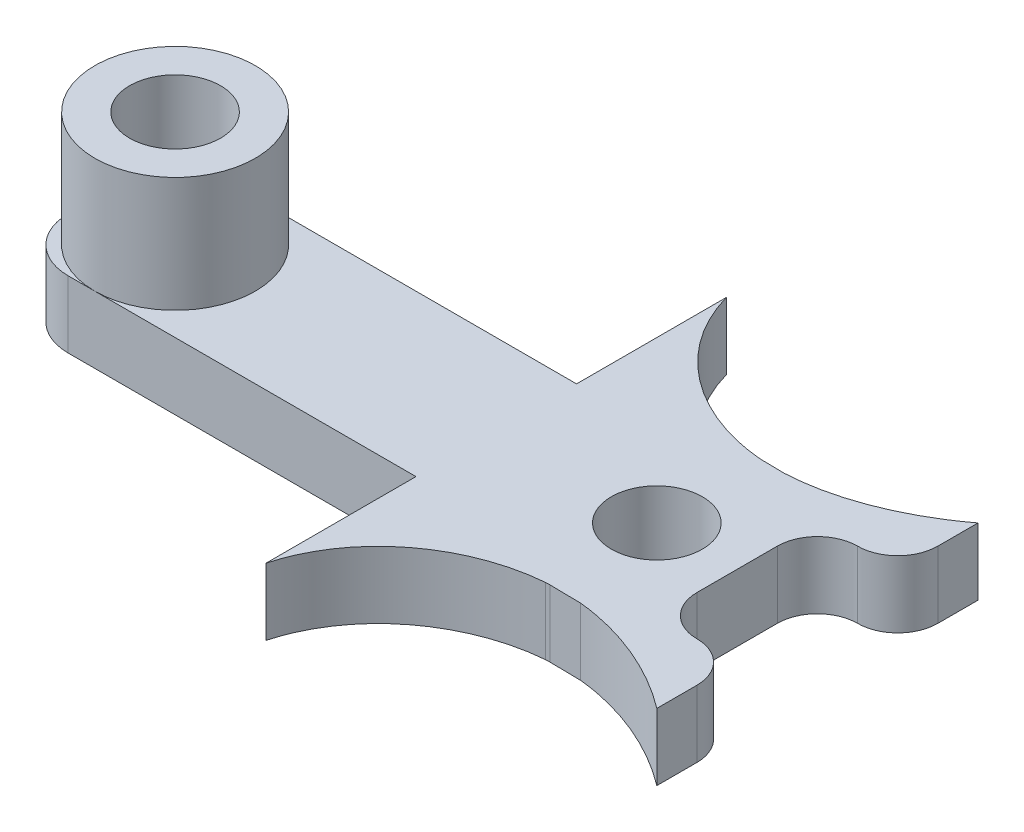
ISO-10303-21;
HEADER;
FILE_DESCRIPTION(('STEP AP214'),'2;1');
FILE_NAME('part.step','',(''),(''),'','','');
FILE_SCHEMA(('AUTOMOTIVE_DESIGN { 1 0 10303 214 1 1 1 1 }'));
ENDSEC;
DATA;
#1=APPLICATION_CONTEXT('core data for automotive mechanical design processes');
#2=APPLICATION_PROTOCOL_DEFINITION('international standard','automotive_design',2000,#1);
#3=PRODUCT_CONTEXT('',#1,'mechanical');
#4=PRODUCT('Part','Part','',(#3));
#5=PRODUCT_RELATED_PRODUCT_CATEGORY('part','',(#4));
#6=PRODUCT_DEFINITION_FORMATION('','',#4);
#7=PRODUCT_DEFINITION_CONTEXT('part definition',#1,'design');
#8=PRODUCT_DEFINITION('design','',#6,#7);
#9=PRODUCT_DEFINITION_SHAPE('','',#8);
#10=(LENGTH_UNIT() NAMED_UNIT(*) SI_UNIT(.MILLI.,.METRE.));
#11=(NAMED_UNIT(*) PLANE_ANGLE_UNIT() SI_UNIT($,.RADIAN.));
#12=(NAMED_UNIT(*) SI_UNIT($,.STERADIAN.) SOLID_ANGLE_UNIT());
#13=UNCERTAINTY_MEASURE_WITH_UNIT(LENGTH_MEASURE(1.E-05),#10,'distance_accuracy_value','');
#14=(GEOMETRIC_REPRESENTATION_CONTEXT(3) GLOBAL_UNCERTAINTY_ASSIGNED_CONTEXT((#13)) GLOBAL_UNIT_ASSIGNED_CONTEXT((#10,
#11,#12)) REPRESENTATION_CONTEXT('',''));
#15=CARTESIAN_POINT('',(0.,0.,0.));
#16=DIRECTION('',(0.,0.,1.));
#17=DIRECTION('',(1.,0.,0.));
#18=AXIS2_PLACEMENT_3D('',#15,#16,#17);
#19=CARTESIAN_POINT('',(10.,2.5,1.));
#20=DIRECTION('',(0.,1.,0.));
#21=DIRECTION('',(0.,0.,1.));
#22=AXIS2_PLACEMENT_3D('',#19,#20,#21);
#23=PLANE('',#22);
#24=DIRECTION('',(0.,0.,-1.));
#25=VECTOR('',#24,1.);
#26=CARTESIAN_POINT('',(12.,2.5,-0.999999999999984));
#27=LINE('',#26,#25);
#28=CARTESIAN_POINT('',(12.,2.5,1.5));
#29=VERTEX_POINT('',#28);
#30=CARTESIAN_POINT('',(12.,2.5,-1.5));
#31=VERTEX_POINT('',#30);
#32=EDGE_CURVE('E519',#29,#31,#27,.T.);
#33=ORIENTED_EDGE('',*,*,#32,.T.);
#34=CARTESIAN_POINT('',(13.5,2.5,-1.5));
#35=DIRECTION('',(0.,1.,0.));
#36=DIRECTION('',(0.,0.,1.));
#37=AXIS2_PLACEMENT_3D('',#34,#35,#36);
#38=CIRCLE('',#37,1.5);
#39=CARTESIAN_POINT('',(13.5,2.5,-3.));
#40=VERTEX_POINT('',#39);
#41=EDGE_CURVE('E60',#31,#40,#38,.F.);
#42=ORIENTED_EDGE('',*,*,#41,.T.);
#43=CARTESIAN_POINT('',(13.5,2.5,-4.5));
#44=DIRECTION('',(0.,1.,0.));
#45=DIRECTION('',(0.,0.,1.));
#46=AXIS2_PLACEMENT_3D('',#43,#44,#45);
#47=CIRCLE('',#46,1.5);
#48=CARTESIAN_POINT('',(15.,2.5,-4.5));
#49=VERTEX_POINT('',#48);
#50=EDGE_CURVE('E556',#40,#49,#47,.T.);
#51=ORIENTED_EDGE('',*,*,#50,.T.);
#52=DIRECTION('',(0.,0.,1.));
#53=VECTOR('',#52,1.);
#54=CARTESIAN_POINT('',(15.,2.5,-6.));
#55=LINE('',#54,#53);
#56=CARTESIAN_POINT('',(15.,2.5,-6.));
#57=VERTEX_POINT('',#56);
#58=EDGE_CURVE('E384',#57,#49,#55,.T.);
#59=ORIENTED_EDGE('',*,*,#58,.F.);
#60=CARTESIAN_POINT('',(3.,2.5,-8.6));
#61=CARTESIAN_POINT('',(3.75489441780132,2.5,-5.92427983008468));
#62=CARTESIAN_POINT('',(8.38153455470107,2.5,-2.77584994907777));
#63=CARTESIAN_POINT('',(13.2889752298641,2.5,-4.70512266492978));
#64=CARTESIAN_POINT('',(15.,2.5,-6.));
#65=B_SPLINE_CURVE_WITH_KNOTS('',3,(#60,#61,#62,#63,#64),.UNSPECIFIED.,.F.,.F.,(4,1,4),(0.,
0.541622599228357,1.),.UNSPECIFIED.);
#66=CARTESIAN_POINT('',(9.77847171737435,2.5,-3.98795360413678));
#67=VERTEX_POINT('',#66);
#68=EDGE_CURVE('E278',#67,#57,#65,.T.);
#69=ORIENTED_EDGE('',*,*,#68,.F.);
#70=DIRECTION('',(0.999880292709708,0.,0.0154725644528685));
#71=VECTOR('',#70,1.);
#72=CARTESIAN_POINT('',(10.0771141611198,2.5,-3.98333228647215));
#73=LINE('',#72,#71);
#74=CARTESIAN_POINT('',(9.,2.50000000000001,-4.));
#75=VERTEX_POINT('',#74);
#76=EDGE_CURVE('E327',#75,#67,#73,.T.);
#77=ORIENTED_EDGE('',*,*,#76,.F.);
#78=CARTESIAN_POINT('',(3.,2.5,-6.));
#79=CARTESIAN_POINT('',(5.68377223398316,2.5,-4.05131670194949));
#80=CARTESIAN_POINT('',(9.,2.5,-4.));
#81=B_SPLINE_CURVE_WITH_KNOTS('',2,(#78,#79,#80),.UNSPECIFIED.,.F.,.F.,(3,3),(0.,1.),.UNSPECIFIED.);
#82=CARTESIAN_POINT('',(8.84905438455814,2.5,-4.00332792716161));
#83=VERTEX_POINT('',#82);
#84=EDGE_CURVE('E383',#83,#75,#81,.T.);
#85=ORIENTED_EDGE('',*,*,#84,.F.);
#86=CARTESIAN_POINT('',(3.,2.5,-8.6));
#87=VERTEX_POINT('',#86);
#88=EDGE_CURVE('E268',#87,#83,#65,.T.);
#89=ORIENTED_EDGE('',*,*,#88,.F.);
#90=DIRECTION('',(0.,0.,-1.));
#91=VECTOR('',#90,1.);
#92=CARTESIAN_POINT('',(3.,2.5,-3.));
#93=LINE('',#92,#91);
#94=CARTESIAN_POINT('',(3.,2.5,-3.));
#95=VERTEX_POINT('',#94);
#96=EDGE_CURVE('E370',#95,#87,#93,.T.);
#97=ORIENTED_EDGE('',*,*,#96,.F.);
#98=DIRECTION('',(-1.,0.,0.));
#99=VECTOR('',#98,1.);
#100=CARTESIAN_POINT('',(-9.99999999999998,2.5,-3.));
#101=LINE('',#100,#99);
#102=CARTESIAN_POINT('',(-9.,2.5,-3.));
#103=VERTEX_POINT('',#102);
#104=EDGE_CURVE('E514',#95,#103,#101,.T.);
#105=ORIENTED_EDGE('',*,*,#104,.T.);
#106=CARTESIAN_POINT('',(-9.,2.5,0.));
#107=DIRECTION('',(0.,1.,0.));
#108=DIRECTION('',(0.,0.,1.));
#109=AXIS2_PLACEMENT_3D('',#106,#107,#108);
#110=CIRCLE('',#109,3.);
#111=CARTESIAN_POINT('',(-9.,2.5,3.));
#112=VERTEX_POINT('',#111);
#113=EDGE_CURVE('E512',#112,#103,#110,.T.);
#114=ORIENTED_EDGE('',*,*,#113,.F.);
#115=DIRECTION('',(1.,0.,0.));
#116=VECTOR('',#115,1.);
#117=CARTESIAN_POINT('',(-9.99999999999998,2.5,3.));
#118=LINE('',#117,#116);
#119=CARTESIAN_POINT('',(3.,2.5,3.));
#120=VERTEX_POINT('',#119);
#121=EDGE_CURVE('E210',#112,#120,#118,.T.);
#122=ORIENTED_EDGE('',*,*,#121,.T.);
#123=DIRECTION('',(0.,0.,-1.));
#124=VECTOR('',#123,1.);
#125=CARTESIAN_POINT('',(3.,2.5,6.));
#126=LINE('',#125,#124);
#127=CARTESIAN_POINT('',(3.,2.5,8.6));
#128=VERTEX_POINT('',#127);
#129=EDGE_CURVE('E203',#128,#120,#126,.T.);
#130=ORIENTED_EDGE('',*,*,#129,.F.);
#131=CARTESIAN_POINT('',(15.,2.5,6.));
#132=CARTESIAN_POINT('',(13.2877664091315,2.5,4.70152619520856));
#133=CARTESIAN_POINT('',(8.38380954941895,2.5,2.78716235232995));
#134=CARTESIAN_POINT('',(3.74372488756738,2.5,5.90317915996441));
#135=CARTESIAN_POINT('',(3.,2.5,8.6));
#136=B_SPLINE_CURVE_WITH_KNOTS('',3,(#131,#132,#133,#134,#135),.UNSPECIFIED.,.F.,.F.,(4,1,4),
(0.,0.458213087712618,1.),.UNSPECIFIED.);
#137=CARTESIAN_POINT('',(8.84905438406814,2.5,4.00332792717645));
#138=VERTEX_POINT('',#137);
#139=EDGE_CURVE('E207',#138,#128,#136,.T.);
#140=ORIENTED_EDGE('',*,*,#139,.F.);
#141=CARTESIAN_POINT('',(9.,2.5,4.));
#142=CARTESIAN_POINT('',(5.68377223398316,2.5,4.05131670194948));
#143=CARTESIAN_POINT('',(3.,2.5,6.));
#144=B_SPLINE_CURVE_WITH_KNOTS('',2,(#141,#142,#143),.UNSPECIFIED.,.F.,.F.,(3,3),(0.,1.),.UNSPECIFIED.);
#145=CARTESIAN_POINT('',(9.,2.5,4.));
#146=VERTEX_POINT('',#145);
#147=EDGE_CURVE('E342',#146,#138,#144,.T.);
#148=ORIENTED_EDGE('',*,*,#147,.F.);
#149=DIRECTION('',(-0.999880292709708,0.,-0.0154725644528686));
#150=VECTOR('',#149,1.);
#151=CARTESIAN_POINT('',(9.95334846292694,2.5,4.01475251152186));
#152=LINE('',#151,#150);
#153=CARTESIAN_POINT('',(10.1712546854507,2.5,4.01812448324414));
#154=VERTEX_POINT('',#153);
#155=EDGE_CURVE('E661',#154,#146,#152,.T.);
#156=ORIENTED_EDGE('',*,*,#155,.F.);
#157=CARTESIAN_POINT('',(15.,2.5,6.));
#158=VERTEX_POINT('',#157);
#159=EDGE_CURVE('E227',#158,#154,#136,.T.);
#160=ORIENTED_EDGE('',*,*,#159,.F.);
#161=DIRECTION('',(0.,0.,1.));
#162=VECTOR('',#161,1.);
#163=CARTESIAN_POINT('',(15.,2.5,3.));
#164=LINE('',#163,#162);
#165=CARTESIAN_POINT('',(15.,2.5,4.5));
#166=VERTEX_POINT('',#165);
#167=EDGE_CURVE('E334',#166,#158,#164,.T.);
#168=ORIENTED_EDGE('',*,*,#167,.F.);
#169=CARTESIAN_POINT('',(13.5,2.5,4.5));
#170=DIRECTION('',(0.,1.,0.));
#171=DIRECTION('',(0.,0.,1.));
#172=AXIS2_PLACEMENT_3D('',#169,#170,#171);
#173=CIRCLE('',#172,1.5);
#174=CARTESIAN_POINT('',(13.5,2.5,3.));
#175=VERTEX_POINT('',#174);
#176=EDGE_CURVE('E553',#166,#175,#173,.T.);
#177=ORIENTED_EDGE('',*,*,#176,.T.);
#178=CARTESIAN_POINT('',(13.5,2.5,1.5));
#179=DIRECTION('',(0.,1.,0.));
#180=DIRECTION('',(0.,0.,1.));
#181=AXIS2_PLACEMENT_3D('',#178,#179,#180);
#182=CIRCLE('',#181,1.5);
#183=EDGE_CURVE('E11',#175,#29,#182,.F.);
#184=ORIENTED_EDGE('',*,*,#183,.T.);
#185=EDGE_LOOP('',(#33,#42,#51,#59,#69,#77,#85,#89,#97,#105,#114,#122,#130,#140,#148,#156,#160,
#168,#177,#184));
#186=FACE_BOUND('',#185,.T.);
#187=CARTESIAN_POINT('',(9.,2.5,0.));
#188=DIRECTION('',(0.,1.,0.));
#189=DIRECTION('',(0.,0.,1.));
#190=AXIS2_PLACEMENT_3D('',#187,#188,#189);
#191=CIRCLE('',#190,1.7);
#192=CARTESIAN_POINT('',(9.,2.5,1.7));
#193=VERTEX_POINT('',#192);
#194=EDGE_CURVE('E966',#193,#193,#191,.T.);
#195=ORIENTED_EDGE('',*,*,#194,.F.);
#196=EDGE_LOOP('',(#195));
#197=FACE_BOUND('',#196,.T.);
#198=ADVANCED_FACE('F42',(#186,#197),#23,.T.);
#199=CARTESIAN_POINT('',(-12.,2.5,0.));
#200=VERTEX_POINT('',#199);
#201=EDGE_CURVE('E499',#103,#200,#110,.T.);
#202=ORIENTED_EDGE('',*,*,#201,.F.);
#203=CARTESIAN_POINT('',(-9.99999999999998,2.5,-3.));
#204=VERTEX_POINT('',#203);
#205=EDGE_CURVE('E501',#103,#204,#101,.T.);
#206=ORIENTED_EDGE('',*,*,#205,.T.);
#207=CARTESIAN_POINT('',(-10.,2.5,-1.));
#208=DIRECTION('',(0.,1.,0.));
#209=DIRECTION('',(0.,0.,1.));
#210=AXIS2_PLACEMENT_3D('',#207,#208,#209);
#211=CIRCLE('',#210,2.);
#212=CARTESIAN_POINT('',(-12.,2.5,-0.999999999999987));
#213=VERTEX_POINT('',#212);
#214=EDGE_CURVE('E598',#204,#213,#211,.T.);
#215=ORIENTED_EDGE('',*,*,#214,.T.);
#216=DIRECTION('',(0.,0.,1.));
#217=VECTOR('',#216,1.);
#218=CARTESIAN_POINT('',(-12.,2.5,-0.999999999999987));
#219=LINE('',#218,#217);
#220=EDGE_CURVE('E504',#213,#200,#219,.T.);
#221=ORIENTED_EDGE('',*,*,#220,.T.);
#222=EDGE_LOOP('',(#202,#206,#215,#221));
#223=FACE_BOUND('',#222,.T.);
#224=ADVANCED_FACE('F445',(#223),#23,.T.);
#225=EDGE_CURVE('E510',#200,#112,#110,.T.);
#226=ORIENTED_EDGE('',*,*,#225,.F.);
#227=CARTESIAN_POINT('',(-12.,2.5,0.999999999999985));
#228=VERTEX_POINT('',#227);
#229=EDGE_CURVE('E601',#200,#228,#219,.T.);
#230=ORIENTED_EDGE('',*,*,#229,.T.);
#231=CARTESIAN_POINT('',(-10.,2.5,0.999999999999999));
#232=DIRECTION('',(0.,1.,0.));
#233=DIRECTION('',(0.,0.,1.));
#234=AXIS2_PLACEMENT_3D('',#231,#232,#233);
#235=CIRCLE('',#234,2.);
#236=CARTESIAN_POINT('',(-9.99999999999998,2.5,3.));
#237=VERTEX_POINT('',#236);
#238=EDGE_CURVE('E604',#228,#237,#235,.T.);
#239=ORIENTED_EDGE('',*,*,#238,.T.);
#240=EDGE_CURVE('E607',#237,#112,#118,.T.);
#241=ORIENTED_EDGE('',*,*,#240,.T.);
#242=EDGE_LOOP('',(#226,#230,#239,#241));
#243=FACE_BOUND('',#242,.T.);
#244=ADVANCED_FACE('F441',(#243),#23,.T.);
#245=CARTESIAN_POINT('',(10.,0.,1.));
#246=DIRECTION('',(0.,1.,0.));
#247=DIRECTION('',(0.,0.,1.));
#248=AXIS2_PLACEMENT_3D('',#245,#246,#247);
#249=PLANE('',#248);
#250=DIRECTION('',(0.,0.,1.));
#251=VECTOR('',#250,1.);
#252=CARTESIAN_POINT('',(15.,0.,-6.));
#253=LINE('',#252,#251);
#254=CARTESIAN_POINT('',(15.,0.,-6.));
#255=VERTEX_POINT('',#254);
#256=CARTESIAN_POINT('',(15.,0.,-4.5));
#257=VERTEX_POINT('',#256);
#258=EDGE_CURVE('E366',#255,#257,#253,.T.);
#259=ORIENTED_EDGE('',*,*,#258,.T.);
#260=CARTESIAN_POINT('',(13.5,0.,-4.5));
#261=DIRECTION('',(0.,1.,0.));
#262=DIRECTION('',(0.,0.,1.));
#263=AXIS2_PLACEMENT_3D('',#260,#261,#262);
#264=CIRCLE('',#263,1.5);
#265=CARTESIAN_POINT('',(13.5,0.,-3.));
#266=VERTEX_POINT('',#265);
#267=EDGE_CURVE('E550',#257,#266,#264,.F.);
#268=ORIENTED_EDGE('',*,*,#267,.T.);
#269=CARTESIAN_POINT('',(13.5,0.,-1.5));
#270=DIRECTION('',(0.,1.,0.));
#271=DIRECTION('',(0.,0.,1.));
#272=AXIS2_PLACEMENT_3D('',#269,#270,#271);
#273=CIRCLE('',#272,1.5);
#274=CARTESIAN_POINT('',(12.,0.,-1.5));
#275=VERTEX_POINT('',#274);
#276=EDGE_CURVE('E570',#266,#275,#273,.T.);
#277=ORIENTED_EDGE('',*,*,#276,.T.);
#278=DIRECTION('',(0.,0.,-1.));
#279=VECTOR('',#278,1.);
#280=CARTESIAN_POINT('',(12.,0.,-0.999999999999984));
#281=LINE('',#280,#279);
#282=CARTESIAN_POINT('',(12.,0.,1.5));
#283=VERTEX_POINT('',#282);
#284=EDGE_CURVE('E578',#283,#275,#281,.T.);
#285=ORIENTED_EDGE('',*,*,#284,.F.);
#286=CARTESIAN_POINT('',(13.5,0.,1.5));
#287=DIRECTION('',(0.,1.,0.));
#288=DIRECTION('',(0.,0.,1.));
#289=AXIS2_PLACEMENT_3D('',#286,#287,#288);
#290=CIRCLE('',#289,1.5);
#291=CARTESIAN_POINT('',(13.5,0.,3.));
#292=VERTEX_POINT('',#291);
#293=EDGE_CURVE('E52',#283,#292,#290,.T.);
#294=ORIENTED_EDGE('',*,*,#293,.T.);
#295=CARTESIAN_POINT('',(13.5,0.,4.5));
#296=DIRECTION('',(0.,1.,0.));
#297=DIRECTION('',(0.,0.,1.));
#298=AXIS2_PLACEMENT_3D('',#295,#296,#297);
#299=CIRCLE('',#298,1.5);
#300=CARTESIAN_POINT('',(15.,0.,4.5));
#301=VERTEX_POINT('',#300);
#302=EDGE_CURVE('E547',#292,#301,#299,.F.);
#303=ORIENTED_EDGE('',*,*,#302,.T.);
#304=DIRECTION('',(0.,0.,1.));
#305=VECTOR('',#304,1.);
#306=CARTESIAN_POINT('',(15.,0.,3.));
#307=LINE('',#306,#305);
#308=CARTESIAN_POINT('',(15.,0.,6.));
#309=VERTEX_POINT('',#308);
#310=EDGE_CURVE('E216',#301,#309,#307,.T.);
#311=ORIENTED_EDGE('',*,*,#310,.T.);
#312=CARTESIAN_POINT('',(15.,0.,6.));
#313=CARTESIAN_POINT('',(13.2877664091315,0.,4.70152619520856));
#314=CARTESIAN_POINT('',(8.38380954941895,0.,2.78716235232995));
#315=CARTESIAN_POINT('',(3.74372488756738,0.,5.90317915996441));
#316=CARTESIAN_POINT('',(3.,0.,8.6));
#317=B_SPLINE_CURVE_WITH_KNOTS('',3,(#312,#313,#314,#315,#316),.UNSPECIFIED.,.F.,.F.,(4,1,4),
(0.,0.458213087712618,1.),.UNSPECIFIED.);
#318=CARTESIAN_POINT('',(10.1712546854507,0.,4.01812448324414));
#319=VERTEX_POINT('',#318);
#320=EDGE_CURVE('E246',#309,#319,#317,.T.);
#321=ORIENTED_EDGE('',*,*,#320,.T.);
#322=DIRECTION('',(0.999880292709708,0.,0.0154725644528686));
#323=VECTOR('',#322,1.);
#324=CARTESIAN_POINT('',(9.,0.,4.));
#325=LINE('',#324,#323);
#326=CARTESIAN_POINT('',(9.,0.,4.));
#327=VERTEX_POINT('',#326);
#328=EDGE_CURVE('E655',#327,#319,#325,.T.);
#329=ORIENTED_EDGE('',*,*,#328,.F.);
#330=CARTESIAN_POINT('',(9.,0.,4.));
#331=CARTESIAN_POINT('',(5.68377223398316,0.,4.05131670194948));
#332=CARTESIAN_POINT('',(3.,0.,6.));
#333=B_SPLINE_CURVE_WITH_KNOTS('',2,(#330,#331,#332),.UNSPECIFIED.,.F.,.F.,(3,3),(0.,1.),.UNSPECIFIED.);
#334=CARTESIAN_POINT('',(8.8490543840833,0.,4.00332792717521));
#335=VERTEX_POINT('',#334);
#336=EDGE_CURVE('E352',#327,#335,#333,.T.);
#337=ORIENTED_EDGE('',*,*,#336,.T.);
#338=CARTESIAN_POINT('',(3.,0.,8.6));
#339=VERTEX_POINT('',#338);
#340=EDGE_CURVE('E245',#335,#339,#317,.T.);
#341=ORIENTED_EDGE('',*,*,#340,.T.);
#342=DIRECTION('',(0.,0.,-1.));
#343=VECTOR('',#342,1.);
#344=CARTESIAN_POINT('',(3.,0.,6.));
#345=LINE('',#344,#343);
#346=CARTESIAN_POINT('',(3.,0.,3.));
#347=VERTEX_POINT('',#346);
#348=EDGE_CURVE('E230',#339,#347,#345,.T.);
#349=ORIENTED_EDGE('',*,*,#348,.T.);
#350=DIRECTION('',(1.,0.,0.));
#351=VECTOR('',#350,1.);
#352=CARTESIAN_POINT('',(-9.99999999999998,0.,3.));
#353=LINE('',#352,#351);
#354=CARTESIAN_POINT('',(-9.99999999999998,0.,3.));
#355=VERTEX_POINT('',#354);
#356=EDGE_CURVE('E587',#355,#347,#353,.T.);
#357=ORIENTED_EDGE('',*,*,#356,.F.);
#358=CARTESIAN_POINT('',(-10.,0.,0.999999999999999));
#359=DIRECTION('',(0.,1.,0.));
#360=DIRECTION('',(0.,0.,1.));
#361=AXIS2_PLACEMENT_3D('',#358,#359,#360);
#362=CIRCLE('',#361,2.);
#363=CARTESIAN_POINT('',(-12.,0.,0.999999999999985));
#364=VERTEX_POINT('',#363);
#365=EDGE_CURVE('E591',#364,#355,#362,.T.);
#366=ORIENTED_EDGE('',*,*,#365,.F.);
#367=DIRECTION('',(0.,0.,1.));
#368=VECTOR('',#367,1.);
#369=CARTESIAN_POINT('',(-12.,0.,-0.999999999999987));
#370=LINE('',#369,#368);
#371=CARTESIAN_POINT('',(-12.,0.,-0.999999999999987));
#372=VERTEX_POINT('',#371);
#373=EDGE_CURVE('E619',#372,#364,#370,.T.);
#374=ORIENTED_EDGE('',*,*,#373,.F.);
#375=CARTESIAN_POINT('',(-10.,0.,-1.));
#376=DIRECTION('',(0.,1.,0.));
#377=DIRECTION('',(0.,0.,1.));
#378=AXIS2_PLACEMENT_3D('',#375,#376,#377);
#379=CIRCLE('',#378,2.);
#380=CARTESIAN_POINT('',(-9.99999999999998,0.,-3.));
#381=VERTEX_POINT('',#380);
#382=EDGE_CURVE('E616',#381,#372,#379,.T.);
#383=ORIENTED_EDGE('',*,*,#382,.F.);
#384=DIRECTION('',(-1.,0.,0.));
#385=VECTOR('',#384,1.);
#386=CARTESIAN_POINT('',(-9.99999999999998,0.,-3.));
#387=LINE('',#386,#385);
#388=CARTESIAN_POINT('',(3.,0.,-3.));
#389=VERTEX_POINT('',#388);
#390=EDGE_CURVE('E613',#389,#381,#387,.T.);
#391=ORIENTED_EDGE('',*,*,#390,.F.);
#392=DIRECTION('',(0.,0.,-1.));
#393=VECTOR('',#392,1.);
#394=CARTESIAN_POINT('',(3.,0.,-3.));
#395=LINE('',#394,#393);
#396=CARTESIAN_POINT('',(3.,0.,-8.6));
#397=VERTEX_POINT('',#396);
#398=EDGE_CURVE('E358',#389,#397,#395,.T.);
#399=ORIENTED_EDGE('',*,*,#398,.T.);
#400=CARTESIAN_POINT('',(3.,0.,-8.6));
#401=CARTESIAN_POINT('',(3.75489441780132,0.,-5.92427983008468));
#402=CARTESIAN_POINT('',(8.38153455470107,0.,-2.77584994907777));
#403=CARTESIAN_POINT('',(13.2889752298641,0.,-4.70512266492978));
#404=CARTESIAN_POINT('',(15.,0.,-6.));
#405=B_SPLINE_CURVE_WITH_KNOTS('',3,(#400,#401,#402,#403,#404),.UNSPECIFIED.,.F.,.F.,(4,1,4),
(0.,0.541622599228357,1.),.UNSPECIFIED.);
#406=CARTESIAN_POINT('',(8.84905438454743,0.,-4.0033279271625));
#407=VERTEX_POINT('',#406);
#408=EDGE_CURVE('E261',#397,#407,#405,.T.);
#409=ORIENTED_EDGE('',*,*,#408,.T.);
#410=CARTESIAN_POINT('',(3.,0.,-6.));
#411=CARTESIAN_POINT('',(5.68377223398316,0.,-4.05131670194949));
#412=CARTESIAN_POINT('',(9.,0.,-4.));
#413=B_SPLINE_CURVE_WITH_KNOTS('',2,(#410,#411,#412),.UNSPECIFIED.,.F.,.F.,(3,3),(0.,1.),.UNSPECIFIED.);
#414=CARTESIAN_POINT('',(9.,0.,-4.));
#415=VERTEX_POINT('',#414);
#416=EDGE_CURVE('E371',#407,#415,#413,.T.);
#417=ORIENTED_EDGE('',*,*,#416,.T.);
#418=DIRECTION('',(-0.999880292709708,0.,-0.0154725644528685));
#419=VECTOR('',#418,1.);
#420=CARTESIAN_POINT('',(9.,0.,-4.));
#421=LINE('',#420,#419);
#422=CARTESIAN_POINT('',(9.77847171737436,0.,-3.98795360413678));
#423=VERTEX_POINT('',#422);
#424=EDGE_CURVE('E649',#423,#415,#421,.T.);
#425=ORIENTED_EDGE('',*,*,#424,.F.);
#426=EDGE_CURVE('E260',#423,#255,#405,.T.);
#427=ORIENTED_EDGE('',*,*,#426,.T.);
#428=EDGE_LOOP('',(#259,#268,#277,#285,#294,#303,#311,#321,#329,#337,#341,#349,#357,#366,#374,
#383,#391,#399,#409,#417,#425,#427));
#429=FACE_BOUND('',#428,.T.);
#430=CARTESIAN_POINT('',(-9.,0.,0.));
#431=DIRECTION('',(0.,1.,0.));
#432=DIRECTION('',(0.,0.,1.));
#433=AXIS2_PLACEMENT_3D('',#430,#431,#432);
#434=CIRCLE('',#433,1.7);
#435=CARTESIAN_POINT('',(-9.,0.,1.7));
#436=VERTEX_POINT('',#435);
#437=EDGE_CURVE('E594',#436,#436,#434,.T.);
#438=ORIENTED_EDGE('',*,*,#437,.T.);
#439=EDGE_LOOP('',(#438));
#440=FACE_BOUND('',#439,.T.);
#441=CARTESIAN_POINT('',(9.,0.,0.));
#442=DIRECTION('',(0.,1.,0.));
#443=DIRECTION('',(0.,0.,1.));
#444=AXIS2_PLACEMENT_3D('',#441,#442,#443);
#445=CIRCLE('',#444,1.7);
#446=CARTESIAN_POINT('',(9.,0.,1.7));
#447=VERTEX_POINT('',#446);
#448=EDGE_CURVE('E526',#447,#447,#445,.T.);
#449=ORIENTED_EDGE('',*,*,#448,.T.);
#450=EDGE_LOOP('',(#449));
#451=FACE_BOUND('',#450,.T.);
#452=ADVANCED_FACE('F444',(#429,#440,#451),#249,.F.);
#453=CARTESIAN_POINT('',(12.,2.5,-0.999999999999984));
#454=DIRECTION('',(-1.,0.,0.));
#455=DIRECTION('',(0.,0.,1.));
#456=AXIS2_PLACEMENT_3D('',#453,#454,#455);
#457=PLANE('',#456);
#458=ORIENTED_EDGE('',*,*,#284,.T.);
#459=DIRECTION('',(0.,1.,0.));
#460=VECTOR('',#459,1.);
#461=CARTESIAN_POINT('',(12.,2.5,-1.5));
#462=LINE('',#461,#460);
#463=EDGE_CURVE('E68',#275,#31,#462,.T.);
#464=ORIENTED_EDGE('',*,*,#463,.T.);
#465=ORIENTED_EDGE('',*,*,#32,.F.);
#466=DIRECTION('',(0.,-1.,0.));
#467=VECTOR('',#466,1.);
#468=CARTESIAN_POINT('',(12.,2.5,1.5));
#469=LINE('',#468,#467);
#470=EDGE_CURVE('E559',#29,#283,#469,.T.);
#471=ORIENTED_EDGE('',*,*,#470,.T.);
#472=EDGE_LOOP('',(#458,#464,#465,#471));
#473=FACE_BOUND('',#472,.T.);
#474=ADVANCED_FACE('F449',(#473),#457,.F.);
#475=CARTESIAN_POINT('',(-9.99999999999998,2.5,-3.));
#476=DIRECTION('',(0.,0.,1.));
#477=DIRECTION('',(1.,0.,0.));
#478=AXIS2_PLACEMENT_3D('',#475,#476,#477);
#479=PLANE('',#478);
#480=ORIENTED_EDGE('',*,*,#104,.F.);
#481=DIRECTION('',(0.,-1.,0.));
#482=VECTOR('',#481,1.);
#483=CARTESIAN_POINT('',(3.,14.869316876853,-3.));
#484=LINE('',#483,#482);
#485=EDGE_CURVE('E388',#95,#389,#484,.T.);
#486=ORIENTED_EDGE('',*,*,#485,.T.);
#487=ORIENTED_EDGE('',*,*,#390,.T.);
#488=DIRECTION('',(0.,-1.,0.));
#489=VECTOR('',#488,1.);
#490=CARTESIAN_POINT('',(-9.99999999999998,2.5,-3.));
#491=LINE('',#490,#489);
#492=EDGE_CURVE('E516',#204,#381,#491,.T.);
#493=ORIENTED_EDGE('',*,*,#492,.F.);
#494=ORIENTED_EDGE('',*,*,#205,.F.);
#495=EDGE_LOOP('',(#480,#486,#487,#493,#494));
#496=FACE_BOUND('',#495,.T.);
#497=ADVANCED_FACE('F465',(#496),#479,.F.);
#498=CARTESIAN_POINT('',(-10.,2.5,-1.));
#499=DIRECTION('',(0.,-1.,0.));
#500=DIRECTION('',(0.,0.,-1.));
#501=AXIS2_PLACEMENT_3D('',#498,#499,#500);
#502=CYLINDRICAL_SURFACE('',#501,2.);
#503=ORIENTED_EDGE('',*,*,#382,.T.);
#504=DIRECTION('',(0.,-1.,0.));
#505=VECTOR('',#504,1.);
#506=CARTESIAN_POINT('',(-12.,2.5,-0.999999999999987));
#507=LINE('',#506,#505);
#508=EDGE_CURVE('E531',#213,#372,#507,.T.);
#509=ORIENTED_EDGE('',*,*,#508,.F.);
#510=ORIENTED_EDGE('',*,*,#214,.F.);
#511=ORIENTED_EDGE('',*,*,#492,.T.);
#512=EDGE_LOOP('',(#503,#509,#510,#511));
#513=FACE_BOUND('',#512,.T.);
#514=ADVANCED_FACE('F461',(#513),#502,.T.);
#515=CARTESIAN_POINT('',(-12.,2.5,-0.999999999999987));
#516=DIRECTION('',(1.,0.,0.));
#517=DIRECTION('',(0.,0.,-1.));
#518=AXIS2_PLACEMENT_3D('',#515,#516,#517);
#519=PLANE('',#518);
#520=ORIENTED_EDGE('',*,*,#373,.T.);
#521=DIRECTION('',(0.,-1.,0.));
#522=VECTOR('',#521,1.);
#523=CARTESIAN_POINT('',(-12.,2.5,0.999999999999985));
#524=LINE('',#523,#522);
#525=EDGE_CURVE('E536',#228,#364,#524,.T.);
#526=ORIENTED_EDGE('',*,*,#525,.F.);
#527=ORIENTED_EDGE('',*,*,#229,.F.);
#528=ORIENTED_EDGE('',*,*,#220,.F.);
#529=ORIENTED_EDGE('',*,*,#508,.T.);
#530=EDGE_LOOP('',(#520,#526,#527,#528,#529));
#531=FACE_BOUND('',#530,.T.);
#532=ADVANCED_FACE('F457',(#531),#519,.F.);
#533=CARTESIAN_POINT('',(-10.,2.5,0.999999999999999));
#534=DIRECTION('',(0.,-1.,0.));
#535=DIRECTION('',(0.,0.,-1.));
#536=AXIS2_PLACEMENT_3D('',#533,#534,#535);
#537=CYLINDRICAL_SURFACE('',#536,2.);
#538=ORIENTED_EDGE('',*,*,#365,.T.);
#539=DIRECTION('',(0.,-1.,0.));
#540=VECTOR('',#539,1.);
#541=CARTESIAN_POINT('',(-9.99999999999998,2.5,3.));
#542=LINE('',#541,#540);
#543=EDGE_CURVE('E610',#237,#355,#542,.T.);
#544=ORIENTED_EDGE('',*,*,#543,.F.);
#545=ORIENTED_EDGE('',*,*,#238,.F.);
#546=ORIENTED_EDGE('',*,*,#525,.T.);
#547=EDGE_LOOP('',(#538,#544,#545,#546));
#548=FACE_BOUND('',#547,.T.);
#549=ADVANCED_FACE('F453',(#548),#537,.T.);
#550=CARTESIAN_POINT('',(-9.99999999999998,2.5,3.));
#551=DIRECTION('',(0.,0.,-1.));
#552=DIRECTION('',(-1.,0.,0.));
#553=AXIS2_PLACEMENT_3D('',#550,#551,#552);
#554=PLANE('',#553);
#555=ORIENTED_EDGE('',*,*,#356,.T.);
#556=DIRECTION('',(0.,-1.,0.));
#557=VECTOR('',#556,1.);
#558=CARTESIAN_POINT('',(3.,14.869316876853,3.));
#559=LINE('',#558,#557);
#560=EDGE_CURVE('E217',#120,#347,#559,.T.);
#561=ORIENTED_EDGE('',*,*,#560,.F.);
#562=ORIENTED_EDGE('',*,*,#121,.F.);
#563=ORIENTED_EDGE('',*,*,#240,.F.);
#564=ORIENTED_EDGE('',*,*,#543,.T.);
#565=EDGE_LOOP('',(#555,#561,#562,#563,#564));
#566=FACE_BOUND('',#565,.T.);
#567=ADVANCED_FACE('F439',(#566),#554,.F.);
#568=CARTESIAN_POINT('',(-9.,2.5,0.));
#569=DIRECTION('',(0.,-1.,0.));
#570=DIRECTION('',(0.,0.,-1.));
#571=AXIS2_PLACEMENT_3D('',#568,#569,#570);
#572=CYLINDRICAL_SURFACE('',#571,1.7);
#573=ORIENTED_EDGE('',*,*,#437,.F.);
#574=EDGE_LOOP('',(#573));
#575=FACE_BOUND('',#574,.T.);
#576=CARTESIAN_POINT('',(-9.,6.8,0.));
#577=DIRECTION('',(0.,1.,0.));
#578=DIRECTION('',(0.,0.,1.));
#579=AXIS2_PLACEMENT_3D('',#576,#577,#578);
#580=CIRCLE('',#579,1.7);
#581=CARTESIAN_POINT('',(-9.,6.8,1.7));
#582=VERTEX_POINT('',#581);
#583=EDGE_CURVE('E407',#582,#582,#580,.T.);
#584=ORIENTED_EDGE('',*,*,#583,.T.);
#585=EDGE_LOOP('',(#584));
#586=FACE_BOUND('',#585,.T.);
#587=ADVANCED_FACE('F435',(#575,#586),#572,.F.);
#588=CARTESIAN_POINT('',(9.,2.5,0.));
#589=DIRECTION('',(0.,-1.,0.));
#590=DIRECTION('',(0.,0.,-1.));
#591=AXIS2_PLACEMENT_3D('',#588,#589,#590);
#592=CYLINDRICAL_SURFACE('',#591,1.7);
#593=ORIENTED_EDGE('',*,*,#194,.T.);
#594=EDGE_LOOP('',(#593));
#595=FACE_BOUND('',#594,.T.);
#596=ORIENTED_EDGE('',*,*,#448,.F.);
#597=EDGE_LOOP('',(#596));
#598=FACE_BOUND('',#597,.T.);
#599=ADVANCED_FACE('F428',(#595,#598),#592,.F.);
#600=CARTESIAN_POINT('',(-9.,6.8,0.));
#601=DIRECTION('',(0.,1.,0.));
#602=DIRECTION('',(0.,0.,1.));
#603=AXIS2_PLACEMENT_3D('',#600,#601,#602);
#604=PLANE('',#603);
#605=CARTESIAN_POINT('',(-9.,6.8,0.));
#606=DIRECTION('',(0.,1.,0.));
#607=DIRECTION('',(0.,0.,1.));
#608=AXIS2_PLACEMENT_3D('',#605,#606,#607);
#609=CIRCLE('',#608,3.);
#610=CARTESIAN_POINT('',(-9.,6.8,3.));
#611=VERTEX_POINT('',#610);
#612=EDGE_CURVE('E522',#611,#611,#609,.T.);
#613=ORIENTED_EDGE('',*,*,#612,.T.);
#614=EDGE_LOOP('',(#613));
#615=FACE_BOUND('',#614,.T.);
#616=ORIENTED_EDGE('',*,*,#583,.F.);
#617=EDGE_LOOP('',(#616));
#618=FACE_BOUND('',#617,.T.);
#619=ADVANCED_FACE('F425',(#615,#618),#604,.T.);
#620=CARTESIAN_POINT('',(-9.,6.8,0.));
#621=DIRECTION('',(0.,-1.,0.));
#622=DIRECTION('',(0.,0.,-1.));
#623=AXIS2_PLACEMENT_3D('',#620,#621,#622);
#624=CYLINDRICAL_SURFACE('',#623,3.);
#625=ORIENTED_EDGE('',*,*,#612,.F.);
#626=EDGE_LOOP('',(#625));
#627=FACE_BOUND('',#626,.T.);
#628=ORIENTED_EDGE('',*,*,#113,.T.);
#629=ORIENTED_EDGE('',*,*,#201,.T.);
#630=ORIENTED_EDGE('',*,*,#225,.T.);
#631=EDGE_LOOP('',(#628,#629,#630));
#632=FACE_BOUND('',#631,.T.);
#633=ADVANCED_FACE('F423',(#627,#632),#624,.T.);
#634=CARTESIAN_POINT('',(3.,14.869316876853,-3.));
#635=DIRECTION('',(-1.,0.,0.));
#636=DIRECTION('',(0.,0.,1.));
#637=AXIS2_PLACEMENT_3D('',#634,#635,#636);
#638=PLANE('',#637);
#639=ORIENTED_EDGE('',*,*,#96,.T.);
#640=DIRECTION('',(0.,-1.,0.));
#641=VECTOR('',#640,1.);
#642=CARTESIAN_POINT('',(3.,15.8386927326353,-8.6));
#643=LINE('',#642,#641);
#644=EDGE_CURVE('E267',#87,#397,#643,.T.);
#645=ORIENTED_EDGE('',*,*,#644,.T.);
#646=ORIENTED_EDGE('',*,*,#398,.F.);
#647=ORIENTED_EDGE('',*,*,#485,.F.);
#648=EDGE_LOOP('',(#639,#645,#646,#647));
#649=FACE_BOUND('',#648,.T.);
#650=ADVANCED_FACE('F419',(#649),#638,.T.);
#651=CARTESIAN_POINT('',(3.,14.869316876853,-6.));
#652=CARTESIAN_POINT('',(5.68377223398316,14.869316876853,-4.05131670194949));
#653=CARTESIAN_POINT('',(9.,14.869316876853,-4.));
#654=B_SPLINE_CURVE_WITH_KNOTS('',2,(#651,#652,#653),.UNSPECIFIED.,.F.,.F.,(3,3),(0.,1.),.UNSPECIFIED.);
#655=DIRECTION('',(0.,-1.,0.));
#656=VECTOR('',#655,1.);
#657=SURFACE_OF_LINEAR_EXTRUSION('',#654,#656);
#658=DIRECTION('',(0.,-1.,0.));
#659=VECTOR('',#658,1.);
#660=CARTESIAN_POINT('',(8.84905438455814,1.25,-4.00332792716161));
#661=LINE('',#660,#659);
#662=EDGE_CURVE('E645',#83,#407,#661,.T.);
#663=ORIENTED_EDGE('',*,*,#662,.F.);
#664=ORIENTED_EDGE('',*,*,#84,.T.);
#665=DIRECTION('',(0.,-1.,0.));
#666=VECTOR('',#665,1.);
#667=CARTESIAN_POINT('',(9.,14.869316876853,-4.));
#668=LINE('',#667,#666);
#669=EDGE_CURVE('E394',#75,#415,#668,.T.);
#670=ORIENTED_EDGE('',*,*,#669,.T.);
#671=ORIENTED_EDGE('',*,*,#416,.F.);
#672=EDGE_LOOP('',(#663,#664,#670,#671));
#673=FACE_BOUND('',#672,.T.);
#674=ADVANCED_FACE('F416',(#673),#657,.T.);
#675=CARTESIAN_POINT('',(15.,14.869316876853,-6.));
#676=DIRECTION('',(1.,0.,0.));
#677=DIRECTION('',(0.,0.,-1.));
#678=AXIS2_PLACEMENT_3D('',#675,#676,#677);
#679=PLANE('',#678);
#680=ORIENTED_EDGE('',*,*,#58,.T.);
#681=DIRECTION('',(0.,-1.,0.));
#682=VECTOR('',#681,1.);
#683=CARTESIAN_POINT('',(15.,14.869316876853,-4.5));
#684=LINE('',#683,#682);
#685=EDGE_CURVE('E543',#49,#257,#684,.T.);
#686=ORIENTED_EDGE('',*,*,#685,.T.);
#687=ORIENTED_EDGE('',*,*,#258,.F.);
#688=DIRECTION('',(0.,-1.,0.));
#689=VECTOR('',#688,1.);
#690=CARTESIAN_POINT('',(15.,14.869316876853,-6.));
#691=LINE('',#690,#689);
#692=EDGE_CURVE('E389',#57,#255,#691,.T.);
#693=ORIENTED_EDGE('',*,*,#692,.F.);
#694=EDGE_LOOP('',(#680,#686,#687,#693));
#695=FACE_BOUND('',#694,.T.);
#696=ADVANCED_FACE('F313',(#695),#679,.T.);
#697=CARTESIAN_POINT('',(3.,14.869316876853,6.));
#698=DIRECTION('',(-1.,0.,0.));
#699=DIRECTION('',(0.,0.,1.));
#700=AXIS2_PLACEMENT_3D('',#697,#698,#699);
#701=PLANE('',#700);
#702=ORIENTED_EDGE('',*,*,#560,.T.);
#703=ORIENTED_EDGE('',*,*,#348,.F.);
#704=DIRECTION('',(0.,-1.,0.));
#705=VECTOR('',#704,1.);
#706=CARTESIAN_POINT('',(3.,15.8386927326353,8.6));
#707=LINE('',#706,#705);
#708=EDGE_CURVE('E224',#128,#339,#707,.T.);
#709=ORIENTED_EDGE('',*,*,#708,.F.);
#710=ORIENTED_EDGE('',*,*,#129,.T.);
#711=EDGE_LOOP('',(#702,#703,#709,#710));
#712=FACE_BOUND('',#711,.T.);
#713=ADVANCED_FACE('F229',(#712),#701,.T.);
#714=CARTESIAN_POINT('',(15.,14.869316876853,3.));
#715=DIRECTION('',(1.,0.,0.));
#716=DIRECTION('',(0.,0.,-1.));
#717=AXIS2_PLACEMENT_3D('',#714,#715,#716);
#718=PLANE('',#717);
#719=ORIENTED_EDGE('',*,*,#310,.F.);
#720=DIRECTION('',(0.,-1.,0.));
#721=VECTOR('',#720,1.);
#722=CARTESIAN_POINT('',(15.,14.869316876853,4.5));
#723=LINE('',#722,#721);
#724=EDGE_CURVE('E565',#301,#166,#723,.F.);
#725=ORIENTED_EDGE('',*,*,#724,.T.);
#726=ORIENTED_EDGE('',*,*,#167,.T.);
#727=DIRECTION('',(0.,-1.,0.));
#728=VECTOR('',#727,1.);
#729=CARTESIAN_POINT('',(15.,14.869316876853,6.));
#730=LINE('',#729,#728);
#731=EDGE_CURVE('E335',#158,#309,#730,.T.);
#732=ORIENTED_EDGE('',*,*,#731,.T.);
#733=EDGE_LOOP('',(#719,#725,#726,#732));
#734=FACE_BOUND('',#733,.T.);
#735=ADVANCED_FACE('F312',(#734),#718,.T.);
#736=CARTESIAN_POINT('',(9.,14.869316876853,4.));
#737=CARTESIAN_POINT('',(5.68377223398316,14.869316876853,4.05131670194948));
#738=CARTESIAN_POINT('',(3.,14.869316876853,6.));
#739=B_SPLINE_CURVE_WITH_KNOTS('',2,(#736,#737,#738),.UNSPECIFIED.,.F.,.F.,(3,3),(0.,1.),.UNSPECIFIED.);
#740=DIRECTION('',(0.,-1.,0.));
#741=VECTOR('',#740,1.);
#742=SURFACE_OF_LINEAR_EXTRUSION('',#739,#741);
#743=DIRECTION('',(0.,-1.,0.));
#744=VECTOR('',#743,1.);
#745=CARTESIAN_POINT('',(8.8490543840833,1.25,4.00332792717521));
#746=LINE('',#745,#744);
#747=EDGE_CURVE('E225',#335,#138,#746,.F.);
#748=ORIENTED_EDGE('',*,*,#747,.F.);
#749=ORIENTED_EDGE('',*,*,#336,.F.);
#750=DIRECTION('',(0.,-1.,0.));
#751=VECTOR('',#750,1.);
#752=CARTESIAN_POINT('',(9.,14.869316876853,4.));
#753=LINE('',#752,#751);
#754=EDGE_CURVE('E339',#146,#327,#753,.T.);
#755=ORIENTED_EDGE('',*,*,#754,.F.);
#756=ORIENTED_EDGE('',*,*,#147,.T.);
#757=EDGE_LOOP('',(#748,#749,#755,#756));
#758=FACE_BOUND('',#757,.T.);
#759=ADVANCED_FACE('F305',(#758),#742,.T.);
#760=CARTESIAN_POINT('',(9.,10.,4.));
#761=DIRECTION('',(0.0154725644528686,0.,-0.999880292709708));
#762=DIRECTION('',(-0.999880292709708,0.,-0.0154725644528686));
#763=AXIS2_PLACEMENT_3D('',#760,#761,#762);
#764=PLANE('',#763);
#765=ORIENTED_EDGE('',*,*,#328,.T.);
#766=DIRECTION('',(0.,-1.,0.));
#767=VECTOR('',#766,1.);
#768=CARTESIAN_POINT('',(10.1712546854507,1.25,4.01812448324414));
#769=LINE('',#768,#767);
#770=EDGE_CURVE('E509',#319,#154,#769,.F.);
#771=ORIENTED_EDGE('',*,*,#770,.T.);
#772=ORIENTED_EDGE('',*,*,#155,.T.);
#773=ORIENTED_EDGE('',*,*,#754,.T.);
#774=EDGE_LOOP('',(#765,#771,#772,#773));
#775=FACE_BOUND('',#774,.T.);
#776=ADVANCED_FACE('F301',(#775),#764,.F.);
#777=CARTESIAN_POINT('',(9.,10.,-4.));
#778=DIRECTION('',(-0.0154725644528685,0.,0.999880292709708));
#779=DIRECTION('',(0.999880292709708,0.,0.0154725644528685));
#780=AXIS2_PLACEMENT_3D('',#777,#778,#779);
#781=PLANE('',#780);
#782=ORIENTED_EDGE('',*,*,#76,.T.);
#783=DIRECTION('',(0.,-1.,0.));
#784=VECTOR('',#783,1.);
#785=CARTESIAN_POINT('',(9.77847171737434,1.25,-3.98795360413561));
#786=LINE('',#785,#784);
#787=EDGE_CURVE('E277',#67,#423,#786,.T.);
#788=ORIENTED_EDGE('',*,*,#787,.T.);
#789=ORIENTED_EDGE('',*,*,#424,.T.);
#790=ORIENTED_EDGE('',*,*,#669,.F.);
#791=EDGE_LOOP('',(#782,#788,#789,#790));
#792=FACE_BOUND('',#791,.T.);
#793=ADVANCED_FACE('F304',(#792),#781,.F.);
#794=CARTESIAN_POINT('',(3.,15.8386927326353,-8.6));
#795=CARTESIAN_POINT('',(3.75489441780132,15.8386927326353,-5.92427983008468));
#796=CARTESIAN_POINT('',(8.38153455470107,15.8386927326353,-2.77584994907777));
#797=CARTESIAN_POINT('',(13.2889752298641,15.8386927326353,-4.70512266492978));
#798=CARTESIAN_POINT('',(15.,15.8386927326353,-6.));
#799=B_SPLINE_CURVE_WITH_KNOTS('',3,(#794,#795,#796,#797,#798),.UNSPECIFIED.,.F.,.F.,(4,1,4),
(0.,0.541622599228357,1.),.UNSPECIFIED.);
#800=DIRECTION('',(0.,-1.,0.));
#801=VECTOR('',#800,1.);
#802=SURFACE_OF_LINEAR_EXTRUSION('',#799,#801);
#803=ORIENTED_EDGE('',*,*,#787,.F.);
#804=ORIENTED_EDGE('',*,*,#68,.T.);
#805=ORIENTED_EDGE('',*,*,#692,.T.);
#806=ORIENTED_EDGE('',*,*,#426,.F.);
#807=EDGE_LOOP('',(#803,#804,#805,#806));
#808=FACE_BOUND('',#807,.T.);
#809=ADVANCED_FACE('F299',(#808),#802,.T.);
#810=ORIENTED_EDGE('',*,*,#88,.T.);
#811=ORIENTED_EDGE('',*,*,#662,.T.);
#812=ORIENTED_EDGE('',*,*,#408,.F.);
#813=ORIENTED_EDGE('',*,*,#644,.F.);
#814=EDGE_LOOP('',(#810,#811,#812,#813));
#815=FACE_BOUND('',#814,.T.);
#816=ADVANCED_FACE('F294',(#815),#802,.T.);
#817=CARTESIAN_POINT('',(15.,15.8386927326353,6.));
#818=CARTESIAN_POINT('',(13.2877664091315,15.8386927326353,4.70152619520856));
#819=CARTESIAN_POINT('',(8.38380954941895,15.8386927326353,2.78716235232995));
#820=CARTESIAN_POINT('',(3.74372488756738,15.8386927326353,5.90317915996441));
#821=CARTESIAN_POINT('',(3.,15.8386927326353,8.6));
#822=B_SPLINE_CURVE_WITH_KNOTS('',3,(#817,#818,#819,#820,#821),.UNSPECIFIED.,.F.,.F.,(4,1,4),
(0.,0.458213087712618,1.),.UNSPECIFIED.);
#823=DIRECTION('',(0.,-1.,0.));
#824=VECTOR('',#823,1.);
#825=SURFACE_OF_LINEAR_EXTRUSION('',#822,#824);
#826=ORIENTED_EDGE('',*,*,#770,.F.);
#827=ORIENTED_EDGE('',*,*,#320,.F.);
#828=ORIENTED_EDGE('',*,*,#731,.F.);
#829=ORIENTED_EDGE('',*,*,#159,.T.);
#830=EDGE_LOOP('',(#826,#827,#828,#829));
#831=FACE_BOUND('',#830,.T.);
#832=ADVANCED_FACE('F298',(#831),#825,.T.);
#833=ORIENTED_EDGE('',*,*,#340,.F.);
#834=ORIENTED_EDGE('',*,*,#747,.T.);
#835=ORIENTED_EDGE('',*,*,#139,.T.);
#836=ORIENTED_EDGE('',*,*,#708,.T.);
#837=EDGE_LOOP('',(#833,#834,#835,#836));
#838=FACE_BOUND('',#837,.T.);
#839=ADVANCED_FACE('F223',(#838),#825,.T.);
#840=CARTESIAN_POINT('',(13.5,2.5,-1.5));
#841=DIRECTION('',(0.,1.,0.));
#842=DIRECTION('',(0.,0.,1.));
#843=AXIS2_PLACEMENT_3D('',#840,#841,#842);
#844=CYLINDRICAL_SURFACE('',#843,1.5);
#845=DIRECTION('',(0.,1.,0.));
#846=VECTOR('',#845,1.);
#847=CARTESIAN_POINT('',(13.5,14.869316876853,-3.));
#848=LINE('',#847,#846);
#849=EDGE_CURVE('E233',#40,#266,#848,.F.);
#850=ORIENTED_EDGE('',*,*,#849,.F.);
#851=ORIENTED_EDGE('',*,*,#41,.F.);
#852=ORIENTED_EDGE('',*,*,#463,.F.);
#853=ORIENTED_EDGE('',*,*,#276,.F.);
#854=EDGE_LOOP('',(#850,#851,#852,#853));
#855=FACE_BOUND('',#854,.T.);
#856=ADVANCED_FACE('F475',(#855),#844,.F.);
#857=CARTESIAN_POINT('',(13.5,14.869316876853,-4.5));
#858=DIRECTION('',(0.,-1.,0.));
#859=DIRECTION('',(0.,0.,-1.));
#860=AXIS2_PLACEMENT_3D('',#857,#858,#859);
#861=CYLINDRICAL_SURFACE('',#860,1.5);
#862=ORIENTED_EDGE('',*,*,#50,.F.);
#863=ORIENTED_EDGE('',*,*,#849,.T.);
#864=ORIENTED_EDGE('',*,*,#267,.F.);
#865=ORIENTED_EDGE('',*,*,#685,.F.);
#866=EDGE_LOOP('',(#862,#863,#864,#865));
#867=FACE_BOUND('',#866,.T.);
#868=ADVANCED_FACE('F472',(#867),#861,.T.);
#869=CARTESIAN_POINT('',(13.5,14.869316876853,4.5));
#870=DIRECTION('',(0.,-1.,0.));
#871=DIRECTION('',(0.,0.,-1.));
#872=AXIS2_PLACEMENT_3D('',#869,#870,#871);
#873=CYLINDRICAL_SURFACE('',#872,1.5);
#874=DIRECTION('',(0.,-1.,0.));
#875=VECTOR('',#874,1.);
#876=CARTESIAN_POINT('',(13.5,14.869316876853,3.));
#877=LINE('',#876,#875);
#878=EDGE_CURVE('E46',#175,#292,#877,.T.);
#879=ORIENTED_EDGE('',*,*,#878,.F.);
#880=ORIENTED_EDGE('',*,*,#176,.F.);
#881=ORIENTED_EDGE('',*,*,#724,.F.);
#882=ORIENTED_EDGE('',*,*,#302,.F.);
#883=EDGE_LOOP('',(#879,#880,#881,#882));
#884=FACE_BOUND('',#883,.T.);
#885=ADVANCED_FACE('F44',(#884),#873,.T.);
#886=CARTESIAN_POINT('',(13.5,2.5,1.5));
#887=DIRECTION('',(0.,-1.,0.));
#888=DIRECTION('',(0.,0.,-1.));
#889=AXIS2_PLACEMENT_3D('',#886,#887,#888);
#890=CYLINDRICAL_SURFACE('',#889,1.5);
#891=ORIENTED_EDGE('',*,*,#183,.F.);
#892=ORIENTED_EDGE('',*,*,#878,.T.);
#893=ORIENTED_EDGE('',*,*,#293,.F.);
#894=ORIENTED_EDGE('',*,*,#470,.F.);
#895=EDGE_LOOP('',(#891,#892,#893,#894));
#896=FACE_BOUND('',#895,.T.);
#897=ADVANCED_FACE('F479',(#896),#890,.F.);
#898=CLOSED_SHELL('',(#198,#224,#244,#452,#474,#497,#514,#532,#549,#567,#587,#599,#619,#633,
#650,#674,#696,#713,#735,#759,#776,#793,#809,#816,#832,#839,#856,#868,#885,#897));
#899=MANIFOLD_SOLID_BREP('B2',#898);
#900=ADVANCED_BREP_SHAPE_REPRESENTATION('',(#18,#899),#14);
#901=SHAPE_DEFINITION_REPRESENTATION(#9,#900);
ENDSEC;
END-ISO-10303-21;
